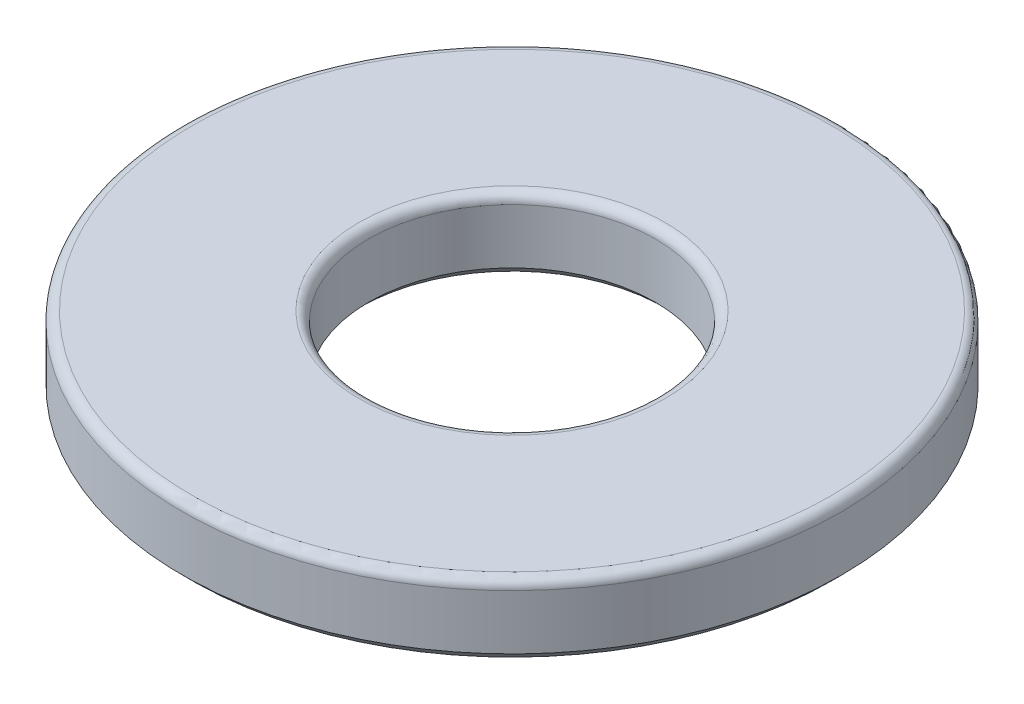
ISO-10303-21;
HEADER;
FILE_DESCRIPTION(('STEP AP214'),'2;1');
FILE_NAME('part.step','',(''),(''),'','','');
FILE_SCHEMA(('AUTOMOTIVE_DESIGN { 1 0 10303 214 1 1 1 1 }'));
ENDSEC;
DATA;
#1=APPLICATION_CONTEXT('core data for automotive mechanical design processes');
#2=APPLICATION_PROTOCOL_DEFINITION('international standard','automotive_design',2000,#1);
#3=PRODUCT_CONTEXT('',#1,'mechanical');
#4=PRODUCT('Part','Part','',(#3));
#5=PRODUCT_RELATED_PRODUCT_CATEGORY('part','',(#4));
#6=PRODUCT_DEFINITION_FORMATION('','',#4);
#7=PRODUCT_DEFINITION_CONTEXT('part definition',#1,'design');
#8=PRODUCT_DEFINITION('design','',#6,#7);
#9=PRODUCT_DEFINITION_SHAPE('','',#8);
#10=(LENGTH_UNIT() NAMED_UNIT(*) SI_UNIT(.MILLI.,.METRE.));
#11=(NAMED_UNIT(*) PLANE_ANGLE_UNIT() SI_UNIT($,.RADIAN.));
#12=(NAMED_UNIT(*) SI_UNIT($,.STERADIAN.) SOLID_ANGLE_UNIT());
#13=UNCERTAINTY_MEASURE_WITH_UNIT(LENGTH_MEASURE(1.E-05),#10,'distance_accuracy_value','');
#14=(GEOMETRIC_REPRESENTATION_CONTEXT(3) GLOBAL_UNCERTAINTY_ASSIGNED_CONTEXT((#13)) GLOBAL_UNIT_ASSIGNED_CONTEXT((#10,
#11,#12)) REPRESENTATION_CONTEXT('',''));
#15=CARTESIAN_POINT('',(0.,0.,0.));
#16=DIRECTION('',(0.,0.,1.));
#17=DIRECTION('',(1.,0.,0.));
#18=AXIS2_PLACEMENT_3D('',#15,#16,#17);
#19=CARTESIAN_POINT('',(4.95,5.,0.));
#20=DIRECTION('',(0.,1.,0.));
#21=DIRECTION('',(-1.,0.,0.));
#22=AXIS2_PLACEMENT_3D('',#19,#20,#21);
#23=PLANE('',#22);
#24=CARTESIAN_POINT('',(0.,5.,0.));
#25=DIRECTION('',(0.,-1.,0.));
#26=DIRECTION('',(1.,0.,0.));
#27=AXIS2_PLACEMENT_3D('',#24,#25,#26);
#28=CIRCLE('',#27,3.2);
#29=CARTESIAN_POINT('',(3.2,5.,0.));
#30=VERTEX_POINT('',#29);
#31=EDGE_CURVE('E11',#30,#30,#28,.T.);
#32=ORIENTED_EDGE('',*,*,#31,.T.);
#33=EDGE_LOOP('',(#32));
#34=FACE_BOUND('',#33,.T.);
#35=CARTESIAN_POINT('',(0.,5.,0.));
#36=DIRECTION('',(0.,-1.,0.));
#37=DIRECTION('',(1.,0.,0.));
#38=AXIS2_PLACEMENT_3D('',#35,#36,#37);
#39=CIRCLE('',#38,6.7);
#40=CARTESIAN_POINT('',(6.7,5.,0.));
#41=VERTEX_POINT('',#40);
#42=EDGE_CURVE('E61',#41,#41,#39,.T.);
#43=ORIENTED_EDGE('',*,*,#42,.F.);
#44=EDGE_LOOP('',(#43));
#45=FACE_BOUND('',#44,.T.);
#46=ADVANCED_FACE('F16',(#34,#45),#23,.T.);
#47=CARTESIAN_POINT('',(0.,4.8,0.));
#48=DIRECTION('',(0.,-1.,0.));
#49=DIRECTION('',(0.,0.,-1.));
#50=AXIS2_PLACEMENT_3D('',#47,#48,#49);
#51=TOROIDAL_SURFACE('',#50,3.2,0.2);
#52=CARTESIAN_POINT('',(0.,4.8,0.));
#53=DIRECTION('',(0.,-1.,0.));
#54=DIRECTION('',(1.,0.,0.));
#55=AXIS2_PLACEMENT_3D('',#52,#53,#54);
#56=CIRCLE('',#55,3.);
#57=CARTESIAN_POINT('',(3.,4.8,0.));
#58=VERTEX_POINT('',#57);
#59=EDGE_CURVE('E26',#58,#58,#56,.T.);
#60=ORIENTED_EDGE('',*,*,#59,.T.);
#61=EDGE_LOOP('',(#60));
#62=FACE_BOUND('',#61,.T.);
#63=ORIENTED_EDGE('',*,*,#31,.F.);
#64=EDGE_LOOP('',(#63));
#65=FACE_BOUND('',#64,.T.);
#66=ADVANCED_FACE('F89',(#62,#65),#51,.T.);
#67=CARTESIAN_POINT('',(0.,4.2262,0.));
#68=DIRECTION('',(0.,1.,0.));
#69=DIRECTION('',(1.,0.,0.));
#70=AXIS2_PLACEMENT_3D('',#67,#68,#69);
#71=CYLINDRICAL_SURFACE('',#70,3.);
#72=CARTESIAN_POINT('',(0.,3.6524,0.));
#73=DIRECTION('',(0.,-1.,0.));
#74=DIRECTION('',(1.,0.,0.));
#75=AXIS2_PLACEMENT_3D('',#72,#73,#74);
#76=CIRCLE('',#75,3.);
#77=CARTESIAN_POINT('',(3.,3.6524,0.));
#78=VERTEX_POINT('',#77);
#79=EDGE_CURVE('E71',#78,#78,#76,.T.);
#80=ORIENTED_EDGE('',*,*,#79,.T.);
#81=EDGE_LOOP('',(#80));
#82=FACE_BOUND('',#81,.T.);
#83=ORIENTED_EDGE('',*,*,#59,.F.);
#84=EDGE_LOOP('',(#83));
#85=FACE_BOUND('',#84,.T.);
#86=ADVANCED_FACE('F94',(#82,#85),#71,.F.);
#87=CARTESIAN_POINT('',(0.,3.5524,0.));
#88=DIRECTION('',(0.,-1.,0.));
#89=DIRECTION('',(1.,0.,0.));
#90=AXIS2_PLACEMENT_3D('',#87,#88,#89);
#91=CONICAL_SURFACE('',#90,3.1,0.785398163397448);
#92=CARTESIAN_POINT('',(0.,3.4524,0.));
#93=DIRECTION('',(0.,-1.,0.));
#94=DIRECTION('',(1.,0.,0.));
#95=AXIS2_PLACEMENT_3D('',#92,#93,#94);
#96=CIRCLE('',#95,3.2);
#97=CARTESIAN_POINT('',(3.2,3.4524,0.));
#98=VERTEX_POINT('',#97);
#99=EDGE_CURVE('E70',#98,#98,#96,.T.);
#100=ORIENTED_EDGE('',*,*,#99,.T.);
#101=EDGE_LOOP('',(#100));
#102=FACE_BOUND('',#101,.T.);
#103=ORIENTED_EDGE('',*,*,#79,.F.);
#104=EDGE_LOOP('',(#103));
#105=FACE_BOUND('',#104,.T.);
#106=ADVANCED_FACE('F18',(#102,#105),#91,.F.);
#107=CARTESIAN_POINT('',(3.74285,3.4524,0.));
#108=DIRECTION('',(0.,-1.,0.));
#109=DIRECTION('',(1.,0.,0.));
#110=AXIS2_PLACEMENT_3D('',#107,#108,#109);
#111=PLANE('',#110);
#112=CARTESIAN_POINT('',(0.,3.4524,0.));
#113=DIRECTION('',(0.,-1.,0.));
#114=DIRECTION('',(1.,0.,0.));
#115=AXIS2_PLACEMENT_3D('',#112,#113,#114);
#116=CIRCLE('',#115,4.2857);
#117=CARTESIAN_POINT('',(4.2857,3.4524,0.));
#118=VERTEX_POINT('',#117);
#119=EDGE_CURVE('E67',#118,#118,#116,.T.);
#120=ORIENTED_EDGE('',*,*,#119,.T.);
#121=EDGE_LOOP('',(#120));
#122=FACE_BOUND('',#121,.T.);
#123=ORIENTED_EDGE('',*,*,#99,.F.);
#124=EDGE_LOOP('',(#123));
#125=FACE_BOUND('',#124,.T.);
#126=ADVANCED_FACE('F140',(#122,#125),#111,.T.);
#127=CARTESIAN_POINT('',(0.,2.5,0.));
#128=DIRECTION('',(0.,-1.,0.));
#129=DIRECTION('',(0.,0.,-1.));
#130=AXIS2_PLACEMENT_3D('',#127,#128,#129);
#131=TOROIDAL_SURFACE('',#130,5.,1.1905);
#132=CARTESIAN_POINT('',(0.,3.4524,0.));
#133=DIRECTION('',(0.,-1.,0.));
#134=DIRECTION('',(1.,0.,0.));
#135=AXIS2_PLACEMENT_3D('',#132,#133,#134);
#136=CIRCLE('',#135,5.7143);
#137=CARTESIAN_POINT('',(5.7143,3.4524,0.));
#138=VERTEX_POINT('',#137);
#139=EDGE_CURVE('E20',#138,#138,#136,.T.);
#140=ORIENTED_EDGE('',*,*,#139,.T.);
#141=EDGE_LOOP('',(#140));
#142=FACE_BOUND('',#141,.T.);
#143=ORIENTED_EDGE('',*,*,#119,.F.);
#144=EDGE_LOOP('',(#143));
#145=FACE_BOUND('',#144,.T.);
#146=ADVANCED_FACE('F102',(#142,#145),#131,.F.);
#147=CARTESIAN_POINT('',(6.20715,3.4524,0.));
#148=DIRECTION('',(0.,-1.,0.));
#149=DIRECTION('',(1.,0.,0.));
#150=AXIS2_PLACEMENT_3D('',#147,#148,#149);
#151=PLANE('',#150);
#152=CARTESIAN_POINT('',(0.,3.4524,0.));
#153=DIRECTION('',(0.,-1.,0.));
#154=DIRECTION('',(1.,0.,0.));
#155=AXIS2_PLACEMENT_3D('',#152,#153,#154);
#156=CIRCLE('',#155,6.7);
#157=CARTESIAN_POINT('',(6.7,3.4524,0.));
#158=VERTEX_POINT('',#157);
#159=EDGE_CURVE('E60',#158,#158,#156,.T.);
#160=ORIENTED_EDGE('',*,*,#159,.T.);
#161=EDGE_LOOP('',(#160));
#162=FACE_BOUND('',#161,.T.);
#163=ORIENTED_EDGE('',*,*,#139,.F.);
#164=EDGE_LOOP('',(#163));
#165=FACE_BOUND('',#164,.T.);
#166=ADVANCED_FACE('F100',(#162,#165),#151,.T.);
#167=CARTESIAN_POINT('',(0.,3.5524,0.));
#168=DIRECTION('',(0.,1.,0.));
#169=DIRECTION('',(1.,0.,0.));
#170=AXIS2_PLACEMENT_3D('',#167,#168,#169);
#171=CONICAL_SURFACE('',#170,6.8,0.78539816339745);
#172=CARTESIAN_POINT('',(0.,3.6524,0.));
#173=DIRECTION('',(0.,-1.,0.));
#174=DIRECTION('',(1.,0.,0.));
#175=AXIS2_PLACEMENT_3D('',#172,#173,#174);
#176=CIRCLE('',#175,6.9);
#177=CARTESIAN_POINT('',(6.9,3.6524,0.));
#178=VERTEX_POINT('',#177);
#179=EDGE_CURVE('E56',#178,#178,#176,.T.);
#180=ORIENTED_EDGE('',*,*,#179,.T.);
#181=EDGE_LOOP('',(#180));
#182=FACE_BOUND('',#181,.T.);
#183=ORIENTED_EDGE('',*,*,#159,.F.);
#184=EDGE_LOOP('',(#183));
#185=FACE_BOUND('',#184,.T.);
#186=ADVANCED_FACE('F57',(#182,#185),#171,.T.);
#187=CARTESIAN_POINT('',(0.,4.2262,0.));
#188=DIRECTION('',(0.,1.,0.));
#189=DIRECTION('',(1.,0.,0.));
#190=AXIS2_PLACEMENT_3D('',#187,#188,#189);
#191=CYLINDRICAL_SURFACE('',#190,6.9);
#192=CARTESIAN_POINT('',(0.,4.8,0.));
#193=DIRECTION('',(0.,-1.,0.));
#194=DIRECTION('',(1.,0.,0.));
#195=AXIS2_PLACEMENT_3D('',#192,#193,#194);
#196=CIRCLE('',#195,6.9);
#197=CARTESIAN_POINT('',(6.9,4.8,0.));
#198=VERTEX_POINT('',#197);
#199=EDGE_CURVE('E64',#198,#198,#196,.T.);
#200=ORIENTED_EDGE('',*,*,#199,.T.);
#201=EDGE_LOOP('',(#200));
#202=FACE_BOUND('',#201,.T.);
#203=ORIENTED_EDGE('',*,*,#179,.F.);
#204=EDGE_LOOP('',(#203));
#205=FACE_BOUND('',#204,.T.);
#206=ADVANCED_FACE('F75',(#202,#205),#191,.T.);
#207=CARTESIAN_POINT('',(0.,4.8,0.));
#208=DIRECTION('',(0.,-1.,0.));
#209=DIRECTION('',(0.,0.,-1.));
#210=AXIS2_PLACEMENT_3D('',#207,#208,#209);
#211=TOROIDAL_SURFACE('',#210,6.7,0.2);
#212=ORIENTED_EDGE('',*,*,#42,.T.);
#213=EDGE_LOOP('',(#212));
#214=FACE_BOUND('',#213,.T.);
#215=ORIENTED_EDGE('',*,*,#199,.F.);
#216=EDGE_LOOP('',(#215));
#217=FACE_BOUND('',#216,.T.);
#218=ADVANCED_FACE('F77',(#214,#217),#211,.T.);
#219=CLOSED_SHELL('',(#46,#66,#86,#106,#126,#146,#166,#186,#206,#218));
#220=MANIFOLD_SOLID_BREP('B1',#219);
#221=ADVANCED_BREP_SHAPE_REPRESENTATION('',(#18,#220),#14);
#222=SHAPE_DEFINITION_REPRESENTATION(#9,#221);
ENDSEC;
END-ISO-10303-21;
